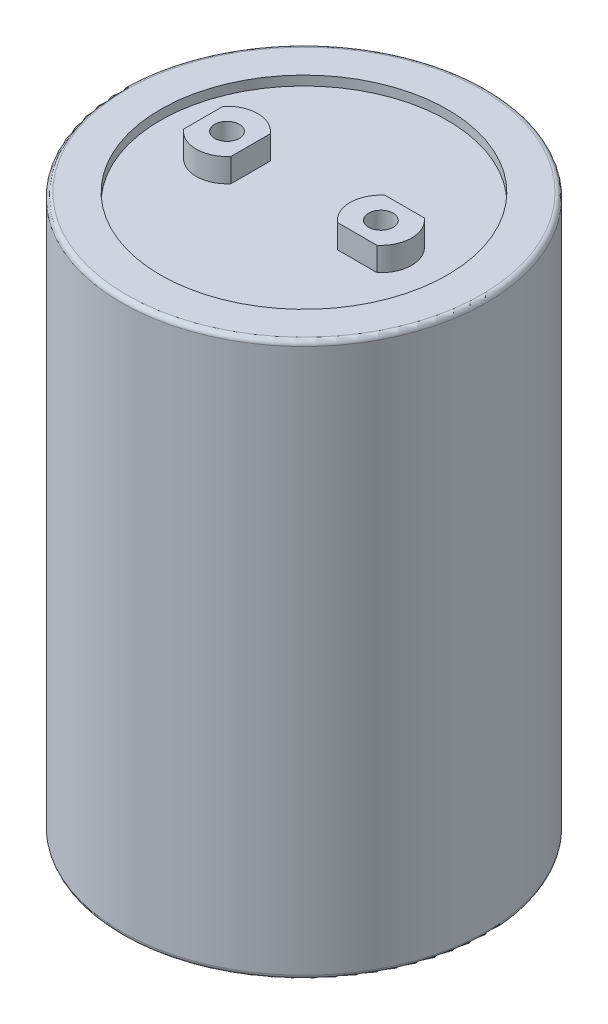
ISO-10303-21;
HEADER;
FILE_DESCRIPTION(('STEP AP214'),'2;1');
FILE_NAME('part.step','',(''),(''),'','','');
FILE_SCHEMA(('AUTOMOTIVE_DESIGN { 1 0 10303 214 1 1 1 1 }'));
ENDSEC;
DATA;
#1=APPLICATION_CONTEXT('core data for automotive mechanical design processes');
#2=APPLICATION_PROTOCOL_DEFINITION('international standard','automotive_design',2000,#1);
#3=PRODUCT_CONTEXT('',#1,'mechanical');
#4=PRODUCT('Part','Part','',(#3));
#5=PRODUCT_RELATED_PRODUCT_CATEGORY('part','',(#4));
#6=PRODUCT_DEFINITION_FORMATION('','',#4);
#7=PRODUCT_DEFINITION_CONTEXT('part definition',#1,'design');
#8=PRODUCT_DEFINITION('design','',#6,#7);
#9=PRODUCT_DEFINITION_SHAPE('','',#8);
#10=(LENGTH_UNIT() NAMED_UNIT(*) SI_UNIT(.MILLI.,.METRE.));
#11=(NAMED_UNIT(*) PLANE_ANGLE_UNIT() SI_UNIT($,.RADIAN.));
#12=(NAMED_UNIT(*) SI_UNIT($,.STERADIAN.) SOLID_ANGLE_UNIT());
#13=UNCERTAINTY_MEASURE_WITH_UNIT(LENGTH_MEASURE(1.E-05),#10,'distance_accuracy_value','');
#14=(GEOMETRIC_REPRESENTATION_CONTEXT(3) GLOBAL_UNCERTAINTY_ASSIGNED_CONTEXT((#13)) GLOBAL_UNIT_ASSIGNED_CONTEXT((#10,
#11,#12)) REPRESENTATION_CONTEXT('',''));
#15=CARTESIAN_POINT('',(0.,0.,0.));
#16=DIRECTION('',(0.,0.,1.));
#17=DIRECTION('',(1.,0.,0.));
#18=AXIS2_PLACEMENT_3D('',#15,#16,#17);
#19=CARTESIAN_POINT('',(0.,115.,0.));
#20=DIRECTION('',(0.,1.,0.));
#21=DIRECTION('',(0.,0.,1.));
#22=AXIS2_PLACEMENT_3D('',#19,#20,#21);
#23=PLANE('',#22);
#24=DIRECTION('',(0.,0.,1.));
#25=VECTOR('',#24,1.);
#26=CARTESIAN_POINT('',(-21.25,115.,-4.15331193145904));
#27=LINE('',#26,#25);
#28=CARTESIAN_POINT('',(-21.25,115.,-4.15331193145904));
#29=VERTEX_POINT('',#28);
#30=CARTESIAN_POINT('',(-21.25,115.,4.15331193145903));
#31=VERTEX_POINT('',#30);
#32=EDGE_CURVE('E146',#29,#31,#27,.T.);
#33=ORIENTED_EDGE('',*,*,#32,.F.);
#34=CARTESIAN_POINT('',(-16.25,115.,0.));
#35=DIRECTION('',(0.,1.,0.));
#36=DIRECTION('',(0.,0.,1.));
#37=AXIS2_PLACEMENT_3D('',#34,#35,#36);
#38=CIRCLE('',#37,6.5);
#39=CARTESIAN_POINT('',(-11.25,115.,-4.15331193145904));
#40=VERTEX_POINT('',#39);
#41=EDGE_CURVE('E128',#40,#29,#38,.T.);
#42=ORIENTED_EDGE('',*,*,#41,.F.);
#43=DIRECTION('',(0.,0.,-1.));
#44=VECTOR('',#43,1.);
#45=CARTESIAN_POINT('',(-11.25,115.,4.15331193145904));
#46=LINE('',#45,#44);
#47=CARTESIAN_POINT('',(-11.25,115.,4.15331193145904));
#48=VERTEX_POINT('',#47);
#49=EDGE_CURVE('E137',#48,#40,#46,.T.);
#50=ORIENTED_EDGE('',*,*,#49,.F.);
#51=CARTESIAN_POINT('',(-16.25,115.,0.));
#52=DIRECTION('',(0.,1.,0.));
#53=DIRECTION('',(0.,0.,-1.));
#54=AXIS2_PLACEMENT_3D('',#51,#52,#53);
#55=CIRCLE('',#54,6.5);
#56=EDGE_CURVE('E148',#31,#48,#55,.T.);
#57=ORIENTED_EDGE('',*,*,#56,.F.);
#58=EDGE_LOOP('',(#33,#42,#50,#57));
#59=FACE_BOUND('',#58,.T.);
#60=DIRECTION('',(-1.,0.,0.));
#61=VECTOR('',#60,1.);
#62=CARTESIAN_POINT('',(12.096688068541,115.,-5.));
#63=LINE('',#62,#61);
#64=CARTESIAN_POINT('',(20.403311931459,115.,-5.));
#65=VERTEX_POINT('',#64);
#66=CARTESIAN_POINT('',(12.096688068541,115.,-5.));
#67=VERTEX_POINT('',#66);
#68=EDGE_CURVE('E212',#65,#67,#63,.T.);
#69=ORIENTED_EDGE('',*,*,#68,.F.);
#70=CARTESIAN_POINT('',(16.25,115.,0.));
#71=DIRECTION('',(0.,1.,0.));
#72=DIRECTION('',(0.,0.,-1.));
#73=AXIS2_PLACEMENT_3D('',#70,#71,#72);
#74=CIRCLE('',#73,6.5);
#75=CARTESIAN_POINT('',(20.403311931459,115.,5.));
#76=VERTEX_POINT('',#75);
#77=EDGE_CURVE('E123',#76,#65,#74,.T.);
#78=ORIENTED_EDGE('',*,*,#77,.F.);
#79=DIRECTION('',(1.,0.,0.));
#80=VECTOR('',#79,1.);
#81=CARTESIAN_POINT('',(20.403311931459,115.,5.));
#82=LINE('',#81,#80);
#83=CARTESIAN_POINT('',(12.096688068541,115.,5.));
#84=VERTEX_POINT('',#83);
#85=EDGE_CURVE('E119',#84,#76,#82,.T.);
#86=ORIENTED_EDGE('',*,*,#85,.F.);
#87=CARTESIAN_POINT('',(16.25,115.,0.));
#88=DIRECTION('',(0.,1.,0.));
#89=DIRECTION('',(0.,0.,1.));
#90=AXIS2_PLACEMENT_3D('',#87,#88,#89);
#91=CIRCLE('',#90,6.50000000000001);
#92=EDGE_CURVE('E214',#67,#84,#91,.T.);
#93=ORIENTED_EDGE('',*,*,#92,.F.);
#94=EDGE_LOOP('',(#69,#78,#86,#93));
#95=FACE_BOUND('',#94,.T.);
#96=CARTESIAN_POINT('',(0.,115.,0.));
#97=DIRECTION('',(0.,1.,0.));
#98=DIRECTION('',(0.,0.,1.));
#99=AXIS2_PLACEMENT_3D('',#96,#97,#98);
#100=CIRCLE('',#99,30.3);
#101=CARTESIAN_POINT('',(0.,115.,30.3));
#102=VERTEX_POINT('',#101);
#103=EDGE_CURVE('E165',#102,#102,#100,.F.);
#104=ORIENTED_EDGE('',*,*,#103,.F.);
#105=EDGE_LOOP('',(#104));
#106=FACE_BOUND('',#105,.T.);
#107=ADVANCED_FACE('F33',(#59,#95,#106),#23,.T.);
#108=CARTESIAN_POINT('',(-16.25,120.,0.));
#109=DIRECTION('',(0.,1.,0.));
#110=DIRECTION('',(0.,0.,1.));
#111=AXIS2_PLACEMENT_3D('',#108,#109,#110);
#112=PLANE('',#111);
#113=CARTESIAN_POINT('',(-16.25,120.,0.));
#114=DIRECTION('',(0.,1.,0.));
#115=DIRECTION('',(0.,0.,1.));
#116=AXIS2_PLACEMENT_3D('',#113,#114,#115);
#117=CIRCLE('',#116,6.5);
#118=CARTESIAN_POINT('',(-11.25,120.,-4.15331193145904));
#119=VERTEX_POINT('',#118);
#120=CARTESIAN_POINT('',(-21.25,120.,-4.15331193145904));
#121=VERTEX_POINT('',#120);
#122=EDGE_CURVE('E133',#119,#121,#117,.T.);
#123=ORIENTED_EDGE('',*,*,#122,.T.);
#124=DIRECTION('',(0.,0.,1.));
#125=VECTOR('',#124,1.);
#126=CARTESIAN_POINT('',(-21.25,120.,-4.15331193145904));
#127=LINE('',#126,#125);
#128=CARTESIAN_POINT('',(-21.25,120.,4.15331193145903));
#129=VERTEX_POINT('',#128);
#130=EDGE_CURVE('E136',#121,#129,#127,.T.);
#131=ORIENTED_EDGE('',*,*,#130,.T.);
#132=CARTESIAN_POINT('',(-16.25,120.,0.));
#133=DIRECTION('',(0.,1.,0.));
#134=DIRECTION('',(0.,0.,-1.));
#135=AXIS2_PLACEMENT_3D('',#132,#133,#134);
#136=CIRCLE('',#135,6.5);
#137=CARTESIAN_POINT('',(-11.25,120.,4.15331193145904));
#138=VERTEX_POINT('',#137);
#139=EDGE_CURVE('E139',#129,#138,#136,.T.);
#140=ORIENTED_EDGE('',*,*,#139,.T.);
#141=DIRECTION('',(0.,0.,-1.));
#142=VECTOR('',#141,1.);
#143=CARTESIAN_POINT('',(-11.25,120.,4.15331193145904));
#144=LINE('',#143,#142);
#145=EDGE_CURVE('E141',#138,#119,#144,.T.);
#146=ORIENTED_EDGE('',*,*,#145,.T.);
#147=EDGE_LOOP('',(#123,#131,#140,#146));
#148=FACE_BOUND('',#147,.T.);
#149=CARTESIAN_POINT('',(-16.25,120.,0.));
#150=DIRECTION('',(0.,1.,0.));
#151=DIRECTION('',(0.,0.,1.));
#152=AXIS2_PLACEMENT_3D('',#149,#150,#151);
#153=CIRCLE('',#152,2.6);
#154=CARTESIAN_POINT('',(-16.25,120.,2.6));
#155=VERTEX_POINT('',#154);
#156=EDGE_CURVE('E125',#155,#155,#153,.T.);
#157=ORIENTED_EDGE('',*,*,#156,.F.);
#158=EDGE_LOOP('',(#157));
#159=FACE_BOUND('',#158,.T.);
#160=ADVANCED_FACE('F236',(#148,#159),#112,.T.);
#161=CARTESIAN_POINT('',(-16.25,120.,0.));
#162=DIRECTION('',(0.,-1.,0.));
#163=DIRECTION('',(0.,0.,-1.));
#164=AXIS2_PLACEMENT_3D('',#161,#162,#163);
#165=CYLINDRICAL_SURFACE('',#164,6.5);
#166=ORIENTED_EDGE('',*,*,#41,.T.);
#167=DIRECTION('',(0.,-1.,0.));
#168=VECTOR('',#167,1.);
#169=CARTESIAN_POINT('',(-21.25,120.,-4.15331193145904));
#170=LINE('',#169,#168);
#171=EDGE_CURVE('E157',#121,#29,#170,.T.);
#172=ORIENTED_EDGE('',*,*,#171,.F.);
#173=ORIENTED_EDGE('',*,*,#122,.F.);
#174=DIRECTION('',(0.,-1.,0.));
#175=VECTOR('',#174,1.);
#176=CARTESIAN_POINT('',(-11.25,120.,-4.15331193145904));
#177=LINE('',#176,#175);
#178=EDGE_CURVE('E143',#119,#40,#177,.T.);
#179=ORIENTED_EDGE('',*,*,#178,.T.);
#180=EDGE_LOOP('',(#166,#172,#173,#179));
#181=FACE_BOUND('',#180,.T.);
#182=ADVANCED_FACE('F243',(#181),#165,.T.);
#183=CARTESIAN_POINT('',(-21.25,120.,-4.15331193145904));
#184=DIRECTION('',(1.,0.,0.));
#185=DIRECTION('',(0.,0.,-1.));
#186=AXIS2_PLACEMENT_3D('',#183,#184,#185);
#187=PLANE('',#186);
#188=ORIENTED_EDGE('',*,*,#32,.T.);
#189=DIRECTION('',(0.,-1.,0.));
#190=VECTOR('',#189,1.);
#191=CARTESIAN_POINT('',(-21.25,120.,4.15331193145903));
#192=LINE('',#191,#190);
#193=EDGE_CURVE('E154',#129,#31,#192,.T.);
#194=ORIENTED_EDGE('',*,*,#193,.F.);
#195=ORIENTED_EDGE('',*,*,#130,.F.);
#196=ORIENTED_EDGE('',*,*,#171,.T.);
#197=EDGE_LOOP('',(#188,#194,#195,#196));
#198=FACE_BOUND('',#197,.T.);
#199=ADVANCED_FACE('F273',(#198),#187,.F.);
#200=CARTESIAN_POINT('',(-16.25,120.,0.));
#201=DIRECTION('',(0.,-1.,0.));
#202=DIRECTION('',(0.,0.,-1.));
#203=AXIS2_PLACEMENT_3D('',#200,#201,#202);
#204=CYLINDRICAL_SURFACE('',#203,6.5);
#205=ORIENTED_EDGE('',*,*,#56,.T.);
#206=DIRECTION('',(0.,-1.,0.));
#207=VECTOR('',#206,1.);
#208=CARTESIAN_POINT('',(-11.25,120.,4.15331193145904));
#209=LINE('',#208,#207);
#210=EDGE_CURVE('E56',#138,#48,#209,.T.);
#211=ORIENTED_EDGE('',*,*,#210,.F.);
#212=ORIENTED_EDGE('',*,*,#139,.F.);
#213=ORIENTED_EDGE('',*,*,#193,.T.);
#214=EDGE_LOOP('',(#205,#211,#212,#213));
#215=FACE_BOUND('',#214,.T.);
#216=ADVANCED_FACE('F266',(#215),#204,.T.);
#217=CARTESIAN_POINT('',(-11.25,120.,4.15331193145904));
#218=DIRECTION('',(-1.,0.,0.));
#219=DIRECTION('',(0.,0.,1.));
#220=AXIS2_PLACEMENT_3D('',#217,#218,#219);
#221=PLANE('',#220);
#222=ORIENTED_EDGE('',*,*,#49,.T.);
#223=ORIENTED_EDGE('',*,*,#178,.F.);
#224=ORIENTED_EDGE('',*,*,#145,.F.);
#225=ORIENTED_EDGE('',*,*,#210,.T.);
#226=EDGE_LOOP('',(#222,#223,#224,#225));
#227=FACE_BOUND('',#226,.T.);
#228=ADVANCED_FACE('F258',(#227),#221,.F.);
#229=CARTESIAN_POINT('',(-16.25,120.,0.));
#230=DIRECTION('',(0.,-1.,0.));
#231=DIRECTION('',(0.,0.,-1.));
#232=AXIS2_PLACEMENT_3D('',#229,#230,#231);
#233=CYLINDRICAL_SURFACE('',#232,2.6);
#234=ORIENTED_EDGE('',*,*,#156,.T.);
#235=EDGE_LOOP('',(#234));
#236=FACE_BOUND('',#235,.T.);
#237=CARTESIAN_POINT('',(-16.25,115.,0.));
#238=DIRECTION('',(0.,1.,0.));
#239=DIRECTION('',(0.,0.,1.));
#240=AXIS2_PLACEMENT_3D('',#237,#238,#239);
#241=CIRCLE('',#240,2.6);
#242=CARTESIAN_POINT('',(-16.25,115.,2.6));
#243=VERTEX_POINT('',#242);
#244=EDGE_CURVE('E159',#243,#243,#241,.F.);
#245=ORIENTED_EDGE('',*,*,#244,.T.);
#246=EDGE_LOOP('',(#245));
#247=FACE_BOUND('',#246,.T.);
#248=ADVANCED_FACE('F252',(#236,#247),#233,.F.);
#249=ORIENTED_EDGE('',*,*,#244,.F.);
#250=EDGE_LOOP('',(#249));
#251=FACE_BOUND('',#250,.T.);
#252=ADVANCED_FACE('F239',(#251),#23,.T.);
#253=CARTESIAN_POINT('',(16.25,120.,0.));
#254=DIRECTION('',(0.,-1.,0.));
#255=DIRECTION('',(0.,0.,-1.));
#256=AXIS2_PLACEMENT_3D('',#253,#254,#255);
#257=PLANE('',#256);
#258=CARTESIAN_POINT('',(16.25,120.,0.));
#259=DIRECTION('',(0.,1.,0.));
#260=DIRECTION('',(0.,0.,-1.));
#261=AXIS2_PLACEMENT_3D('',#258,#259,#260);
#262=CIRCLE('',#261,6.5);
#263=CARTESIAN_POINT('',(20.403311931459,120.,5.));
#264=VERTEX_POINT('',#263);
#265=CARTESIAN_POINT('',(20.403311931459,120.,-5.));
#266=VERTEX_POINT('',#265);
#267=EDGE_CURVE('E110',#264,#266,#262,.T.);
#268=ORIENTED_EDGE('',*,*,#267,.T.);
#269=DIRECTION('',(-1.,0.,0.));
#270=VECTOR('',#269,1.);
#271=CARTESIAN_POINT('',(12.096688068541,120.,-5.));
#272=LINE('',#271,#270);
#273=CARTESIAN_POINT('',(12.096688068541,120.,-5.));
#274=VERTEX_POINT('',#273);
#275=EDGE_CURVE('E99',#266,#274,#272,.T.);
#276=ORIENTED_EDGE('',*,*,#275,.T.);
#277=CARTESIAN_POINT('',(16.25,120.,0.));
#278=DIRECTION('',(0.,1.,0.));
#279=DIRECTION('',(0.,0.,1.));
#280=AXIS2_PLACEMENT_3D('',#277,#278,#279);
#281=CIRCLE('',#280,6.50000000000001);
#282=CARTESIAN_POINT('',(12.096688068541,120.,5.));
#283=VERTEX_POINT('',#282);
#284=EDGE_CURVE('E109',#274,#283,#281,.T.);
#285=ORIENTED_EDGE('',*,*,#284,.T.);
#286=DIRECTION('',(1.,0.,0.));
#287=VECTOR('',#286,1.);
#288=CARTESIAN_POINT('',(20.403311931459,120.,5.));
#289=LINE('',#288,#287);
#290=EDGE_CURVE('E115',#283,#264,#289,.T.);
#291=ORIENTED_EDGE('',*,*,#290,.T.);
#292=EDGE_LOOP('',(#268,#276,#285,#291));
#293=FACE_BOUND('',#292,.T.);
#294=CARTESIAN_POINT('',(16.25,120.,0.));
#295=DIRECTION('',(0.,1.,0.));
#296=DIRECTION('',(0.,0.,1.));
#297=AXIS2_PLACEMENT_3D('',#294,#295,#296);
#298=CIRCLE('',#297,2.6);
#299=CARTESIAN_POINT('',(16.25,120.,2.6));
#300=VERTEX_POINT('',#299);
#301=EDGE_CURVE('E203',#300,#300,#298,.T.);
#302=ORIENTED_EDGE('',*,*,#301,.F.);
#303=EDGE_LOOP('',(#302));
#304=FACE_BOUND('',#303,.T.);
#305=ADVANCED_FACE('F113',(#293,#304),#257,.F.);
#306=CARTESIAN_POINT('',(16.25,120.,0.));
#307=DIRECTION('',(0.,-1.,0.));
#308=DIRECTION('',(0.,0.,-1.));
#309=AXIS2_PLACEMENT_3D('',#306,#307,#308);
#310=CYLINDRICAL_SURFACE('',#309,6.5);
#311=ORIENTED_EDGE('',*,*,#77,.T.);
#312=DIRECTION('',(0.,-1.,0.));
#313=VECTOR('',#312,1.);
#314=CARTESIAN_POINT('',(20.403311931459,120.,-5.));
#315=LINE('',#314,#313);
#316=EDGE_CURVE('E103',#266,#65,#315,.T.);
#317=ORIENTED_EDGE('',*,*,#316,.F.);
#318=ORIENTED_EDGE('',*,*,#267,.F.);
#319=DIRECTION('',(0.,-1.,0.));
#320=VECTOR('',#319,1.);
#321=CARTESIAN_POINT('',(20.403311931459,120.,5.));
#322=LINE('',#321,#320);
#323=EDGE_CURVE('E210',#264,#76,#322,.T.);
#324=ORIENTED_EDGE('',*,*,#323,.T.);
#325=EDGE_LOOP('',(#311,#317,#318,#324));
#326=FACE_BOUND('',#325,.T.);
#327=ADVANCED_FACE('F121',(#326),#310,.T.);
#328=CARTESIAN_POINT('',(12.096688068541,120.,-5.));
#329=DIRECTION('',(0.,0.,1.));
#330=DIRECTION('',(1.,0.,0.));
#331=AXIS2_PLACEMENT_3D('',#328,#329,#330);
#332=PLANE('',#331);
#333=ORIENTED_EDGE('',*,*,#68,.T.);
#334=DIRECTION('',(0.,-1.,0.));
#335=VECTOR('',#334,1.);
#336=CARTESIAN_POINT('',(12.096688068541,120.,-5.));
#337=LINE('',#336,#335);
#338=EDGE_CURVE('E106',#274,#67,#337,.T.);
#339=ORIENTED_EDGE('',*,*,#338,.F.);
#340=ORIENTED_EDGE('',*,*,#275,.F.);
#341=ORIENTED_EDGE('',*,*,#316,.T.);
#342=EDGE_LOOP('',(#333,#339,#340,#341));
#343=FACE_BOUND('',#342,.T.);
#344=ADVANCED_FACE('F101',(#343),#332,.F.);
#345=CARTESIAN_POINT('',(16.25,120.,0.));
#346=DIRECTION('',(0.,-1.,0.));
#347=DIRECTION('',(0.,0.,-1.));
#348=AXIS2_PLACEMENT_3D('',#345,#346,#347);
#349=CYLINDRICAL_SURFACE('',#348,6.50000000000001);
#350=ORIENTED_EDGE('',*,*,#92,.T.);
#351=DIRECTION('',(0.,-1.,0.));
#352=VECTOR('',#351,1.);
#353=CARTESIAN_POINT('',(12.096688068541,120.,5.));
#354=LINE('',#353,#352);
#355=EDGE_CURVE('E48',#283,#84,#354,.T.);
#356=ORIENTED_EDGE('',*,*,#355,.F.);
#357=ORIENTED_EDGE('',*,*,#284,.F.);
#358=ORIENTED_EDGE('',*,*,#338,.T.);
#359=EDGE_LOOP('',(#350,#356,#357,#358));
#360=FACE_BOUND('',#359,.T.);
#361=ADVANCED_FACE('F222',(#360),#349,.T.);
#362=CARTESIAN_POINT('',(20.403311931459,120.,5.));
#363=DIRECTION('',(0.,0.,-1.));
#364=DIRECTION('',(-1.,0.,0.));
#365=AXIS2_PLACEMENT_3D('',#362,#363,#364);
#366=PLANE('',#365);
#367=ORIENTED_EDGE('',*,*,#85,.T.);
#368=ORIENTED_EDGE('',*,*,#323,.F.);
#369=ORIENTED_EDGE('',*,*,#290,.F.);
#370=ORIENTED_EDGE('',*,*,#355,.T.);
#371=EDGE_LOOP('',(#367,#368,#369,#370));
#372=FACE_BOUND('',#371,.T.);
#373=ADVANCED_FACE('F223',(#372),#366,.F.);
#374=CARTESIAN_POINT('',(16.25,120.,0.));
#375=DIRECTION('',(0.,-1.,0.));
#376=DIRECTION('',(0.,0.,-1.));
#377=AXIS2_PLACEMENT_3D('',#374,#375,#376);
#378=CYLINDRICAL_SURFACE('',#377,2.6);
#379=ORIENTED_EDGE('',*,*,#301,.T.);
#380=EDGE_LOOP('',(#379));
#381=FACE_BOUND('',#380,.T.);
#382=CARTESIAN_POINT('',(16.25,115.,0.));
#383=DIRECTION('',(0.,1.,0.));
#384=DIRECTION('',(0.,0.,1.));
#385=AXIS2_PLACEMENT_3D('',#382,#383,#384);
#386=CIRCLE('',#385,2.6);
#387=CARTESIAN_POINT('',(16.25,115.,2.6));
#388=VERTEX_POINT('',#387);
#389=EDGE_CURVE('E162',#388,#388,#386,.F.);
#390=ORIENTED_EDGE('',*,*,#389,.T.);
#391=EDGE_LOOP('',(#390));
#392=FACE_BOUND('',#391,.T.);
#393=ADVANCED_FACE('F225',(#381,#392),#378,.F.);
#394=ORIENTED_EDGE('',*,*,#389,.F.);
#395=EDGE_LOOP('',(#394));
#396=FACE_BOUND('',#395,.T.);
#397=ADVANCED_FACE('F197',(#396),#23,.T.);
#398=CARTESIAN_POINT('',(0.,117.,0.));
#399=DIRECTION('',(0.,1.,0.));
#400=DIRECTION('',(0.,0.,1.));
#401=AXIS2_PLACEMENT_3D('',#398,#399,#400);
#402=PLANE('',#401);
#403=CARTESIAN_POINT('',(0.,117.,0.));
#404=DIRECTION('',(0.,1.,0.));
#405=DIRECTION('',(0.,0.,1.));
#406=AXIS2_PLACEMENT_3D('',#403,#404,#405);
#407=CIRCLE('',#406,37.5);
#408=CARTESIAN_POINT('',(0.,117.,37.5));
#409=VERTEX_POINT('',#408);
#410=EDGE_CURVE('E11',#409,#409,#407,.T.);
#411=ORIENTED_EDGE('',*,*,#410,.T.);
#412=EDGE_LOOP('',(#411));
#413=FACE_BOUND('',#412,.T.);
#414=CARTESIAN_POINT('',(0.,117.,0.));
#415=DIRECTION('',(0.,1.,0.));
#416=DIRECTION('',(0.,0.,1.));
#417=AXIS2_PLACEMENT_3D('',#414,#415,#416);
#418=CIRCLE('',#417,30.3);
#419=CARTESIAN_POINT('',(0.,117.,30.3));
#420=VERTEX_POINT('',#419);
#421=EDGE_CURVE('E201',#420,#420,#418,.T.);
#422=ORIENTED_EDGE('',*,*,#421,.F.);
#423=EDGE_LOOP('',(#422));
#424=FACE_BOUND('',#423,.T.);
#425=ADVANCED_FACE('F193',(#413,#424),#402,.T.);
#426=CARTESIAN_POINT('',(0.,117.,0.));
#427=DIRECTION('',(0.,-1.,0.));
#428=DIRECTION('',(0.,0.,-1.));
#429=AXIS2_PLACEMENT_3D('',#426,#427,#428);
#430=CYLINDRICAL_SURFACE('',#429,30.3);
#431=ORIENTED_EDGE('',*,*,#421,.T.);
#432=EDGE_LOOP('',(#431));
#433=FACE_BOUND('',#432,.T.);
#434=ORIENTED_EDGE('',*,*,#103,.T.);
#435=EDGE_LOOP('',(#434));
#436=FACE_BOUND('',#435,.T.);
#437=ADVANCED_FACE('F196',(#433,#436),#430,.F.);
#438=CARTESIAN_POINT('',(0.,0.,0.));
#439=DIRECTION('',(0.,1.,0.));
#440=DIRECTION('',(0.,0.,1.));
#441=AXIS2_PLACEMENT_3D('',#438,#439,#440);
#442=PLANE('',#441);
#443=CARTESIAN_POINT('',(0.,0.,0.));
#444=DIRECTION('',(0.,1.,0.));
#445=DIRECTION('',(0.,0.,1.));
#446=AXIS2_PLACEMENT_3D('',#443,#444,#445);
#447=CIRCLE('',#446,37.5);
#448=CARTESIAN_POINT('',(0.,0.,37.5));
#449=VERTEX_POINT('',#448);
#450=EDGE_CURVE('E41',#449,#449,#447,.F.);
#451=ORIENTED_EDGE('',*,*,#450,.T.);
#452=EDGE_LOOP('',(#451));
#453=FACE_BOUND('',#452,.T.);
#454=ADVANCED_FACE('F176',(#453),#442,.F.);
#455=CARTESIAN_POINT('',(0.,115.,0.));
#456=DIRECTION('',(0.,-1.,0.));
#457=DIRECTION('',(0.,0.,-1.));
#458=AXIS2_PLACEMENT_3D('',#455,#456,#457);
#459=CYLINDRICAL_SURFACE('',#458,38.5);
#460=CARTESIAN_POINT('',(0.,1.,0.));
#461=DIRECTION('',(0.,1.,0.));
#462=DIRECTION('',(0.,0.,1.));
#463=AXIS2_PLACEMENT_3D('',#460,#461,#462);
#464=CIRCLE('',#463,38.5);
#465=CARTESIAN_POINT('',(0.,1.,38.5));
#466=VERTEX_POINT('',#465);
#467=EDGE_CURVE('E171',#466,#466,#464,.T.);
#468=ORIENTED_EDGE('',*,*,#467,.T.);
#469=EDGE_LOOP('',(#468));
#470=FACE_BOUND('',#469,.T.);
#471=CARTESIAN_POINT('',(0.,116.,0.));
#472=DIRECTION('',(0.,1.,0.));
#473=DIRECTION('',(0.,0.,1.));
#474=AXIS2_PLACEMENT_3D('',#471,#472,#473);
#475=CIRCLE('',#474,38.5);
#476=CARTESIAN_POINT('',(0.,116.,38.5));
#477=VERTEX_POINT('',#476);
#478=EDGE_CURVE('E168',#477,#477,#475,.F.);
#479=ORIENTED_EDGE('',*,*,#478,.T.);
#480=EDGE_LOOP('',(#479));
#481=FACE_BOUND('',#480,.T.);
#482=ADVANCED_FACE('F181',(#470,#481),#459,.T.);
#483=CARTESIAN_POINT('',(0.,1.,0.));
#484=DIRECTION('',(0.,1.,0.));
#485=DIRECTION('',(0.,0.,1.));
#486=AXIS2_PLACEMENT_3D('',#483,#484,#485);
#487=TOROIDAL_SURFACE('',#486,37.5,1.);
#488=ORIENTED_EDGE('',*,*,#450,.F.);
#489=EDGE_LOOP('',(#488));
#490=FACE_BOUND('',#489,.T.);
#491=ORIENTED_EDGE('',*,*,#467,.F.);
#492=EDGE_LOOP('',(#491));
#493=FACE_BOUND('',#492,.T.);
#494=ADVANCED_FACE('F178',(#490,#493),#487,.T.);
#495=CARTESIAN_POINT('',(0.,116.,0.));
#496=DIRECTION('',(0.,1.,0.));
#497=DIRECTION('',(0.,0.,1.));
#498=AXIS2_PLACEMENT_3D('',#495,#496,#497);
#499=TOROIDAL_SURFACE('',#498,37.5,1.);
#500=ORIENTED_EDGE('',*,*,#478,.F.);
#501=EDGE_LOOP('',(#500));
#502=FACE_BOUND('',#501,.T.);
#503=ORIENTED_EDGE('',*,*,#410,.F.);
#504=EDGE_LOOP('',(#503));
#505=FACE_BOUND('',#504,.T.);
#506=ADVANCED_FACE('F35',(#502,#505),#499,.T.);
#507=CLOSED_SHELL('',(#107,#160,#182,#199,#216,#228,#248,#252,#305,#327,#344,#361,#373,#393,
#397,#425,#437,#454,#482,#494,#506));
#508=MANIFOLD_SOLID_BREP('B2',#507);
#509=ADVANCED_BREP_SHAPE_REPRESENTATION('',(#18,#508),#14);
#510=SHAPE_DEFINITION_REPRESENTATION(#9,#509);
ENDSEC;
END-ISO-10303-21;
